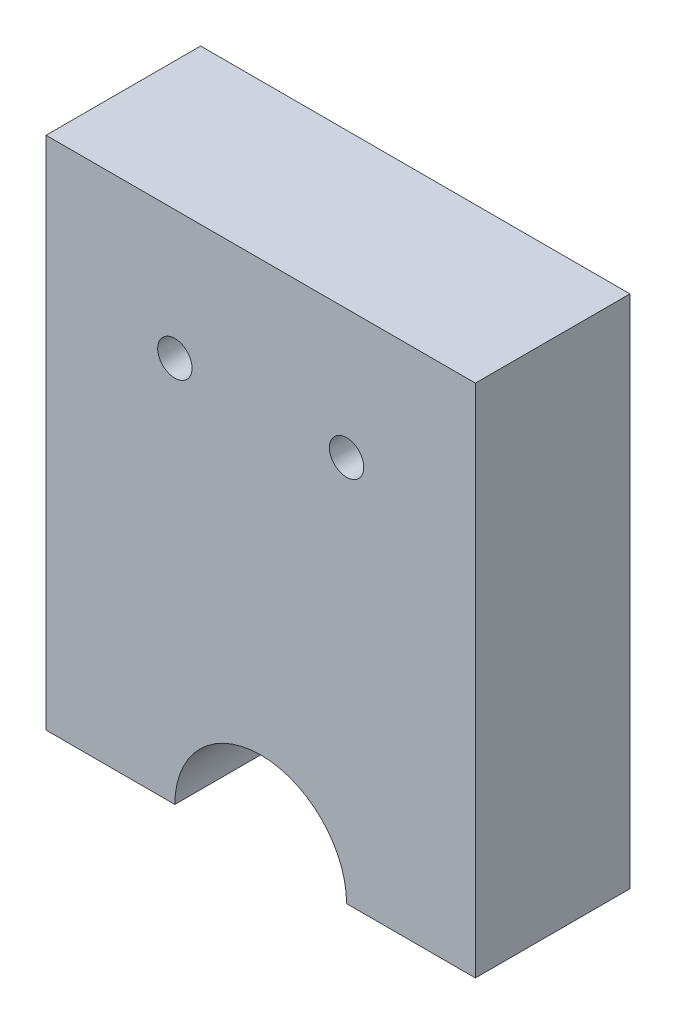
ISO-10303-21;
HEADER;
FILE_DESCRIPTION(('STEP AP214'),'2;1');
FILE_NAME('part.step','',(''),(''),'','','');
FILE_SCHEMA(('AUTOMOTIVE_DESIGN { 1 0 10303 214 1 1 1 1 }'));
ENDSEC;
DATA;
#1=APPLICATION_CONTEXT('core data for automotive mechanical design processes');
#2=APPLICATION_PROTOCOL_DEFINITION('international standard','automotive_design',2000,#1);
#3=PRODUCT_CONTEXT('',#1,'mechanical');
#4=PRODUCT('Part','Part','',(#3));
#5=PRODUCT_RELATED_PRODUCT_CATEGORY('part','',(#4));
#6=PRODUCT_DEFINITION_FORMATION('','',#4);
#7=PRODUCT_DEFINITION_CONTEXT('part definition',#1,'design');
#8=PRODUCT_DEFINITION('design','',#6,#7);
#9=PRODUCT_DEFINITION_SHAPE('','',#8);
#10=(LENGTH_UNIT() NAMED_UNIT(*) SI_UNIT(.MILLI.,.METRE.));
#11=(NAMED_UNIT(*) PLANE_ANGLE_UNIT() SI_UNIT($,.RADIAN.));
#12=(NAMED_UNIT(*) SI_UNIT($,.STERADIAN.) SOLID_ANGLE_UNIT());
#13=UNCERTAINTY_MEASURE_WITH_UNIT(LENGTH_MEASURE(1.E-05),#10,'distance_accuracy_value','');
#14=(GEOMETRIC_REPRESENTATION_CONTEXT(3) GLOBAL_UNCERTAINTY_ASSIGNED_CONTEXT((#13)) GLOBAL_UNIT_ASSIGNED_CONTEXT((#10,
#11,#12)) REPRESENTATION_CONTEXT('',''));
#15=CARTESIAN_POINT('',(0.,0.,0.));
#16=DIRECTION('',(0.,0.,1.));
#17=DIRECTION('',(1.,0.,0.));
#18=AXIS2_PLACEMENT_3D('',#15,#16,#17);
#19=CARTESIAN_POINT('',(0.,0.,9.));
#20=DIRECTION('',(0.,1.,0.));
#21=DIRECTION('',(0.,0.,1.));
#22=AXIS2_PLACEMENT_3D('',#19,#20,#21);
#23=PLANE('',#22);
#24=DIRECTION('',(1.,0.,0.));
#25=VECTOR('',#24,1.);
#26=CARTESIAN_POINT('',(0.,0.,0.));
#27=LINE('',#26,#25);
#28=CARTESIAN_POINT('',(0.,0.,0.));
#29=VERTEX_POINT('',#28);
#30=CARTESIAN_POINT('',(7.5,0.,0.));
#31=VERTEX_POINT('',#30);
#32=EDGE_CURVE('E116',#29,#31,#27,.T.);
#33=ORIENTED_EDGE('',*,*,#32,.T.);
#34=DIRECTION('',(0.,0.,1.));
#35=VECTOR('',#34,1.);
#36=CARTESIAN_POINT('',(7.5,0.,0.));
#37=LINE('',#36,#35);
#38=CARTESIAN_POINT('',(7.5,0.,9.));
#39=VERTEX_POINT('',#38);
#40=EDGE_CURVE('E51',#31,#39,#37,.T.);
#41=ORIENTED_EDGE('',*,*,#40,.T.);
#42=DIRECTION('',(1.,0.,0.));
#43=VECTOR('',#42,1.);
#44=CARTESIAN_POINT('',(0.,0.,9.));
#45=LINE('',#44,#43);
#46=CARTESIAN_POINT('',(0.,0.,9.));
#47=VERTEX_POINT('',#46);
#48=EDGE_CURVE('E87',#47,#39,#45,.T.);
#49=ORIENTED_EDGE('',*,*,#48,.F.);
#50=DIRECTION('',(0.,0.,-1.));
#51=VECTOR('',#50,1.);
#52=CARTESIAN_POINT('',(0.,0.,9.));
#53=LINE('',#52,#51);
#54=EDGE_CURVE('E11',#47,#29,#53,.T.);
#55=ORIENTED_EDGE('',*,*,#54,.T.);
#56=EDGE_LOOP('',(#33,#41,#49,#55));
#57=FACE_BOUND('',#56,.T.);
#58=ADVANCED_FACE('F36',(#57),#23,.F.);
#59=CARTESIAN_POINT('',(0.,0.,9.));
#60=DIRECTION('',(1.,0.,0.));
#61=DIRECTION('',(0.,0.,-1.));
#62=AXIS2_PLACEMENT_3D('',#59,#60,#61);
#63=PLANE('',#62);
#64=DIRECTION('',(0.,-1.,0.));
#65=VECTOR('',#64,1.);
#66=CARTESIAN_POINT('',(0.,0.,0.));
#67=LINE('',#66,#65);
#68=CARTESIAN_POINT('',(0.,30.,0.));
#69=VERTEX_POINT('',#68);
#70=EDGE_CURVE('E117',#69,#29,#67,.T.);
#71=ORIENTED_EDGE('',*,*,#70,.T.);
#72=ORIENTED_EDGE('',*,*,#54,.F.);
#73=DIRECTION('',(0.,-1.,0.));
#74=VECTOR('',#73,1.);
#75=CARTESIAN_POINT('',(0.,0.,9.));
#76=LINE('',#75,#74);
#77=CARTESIAN_POINT('',(0.,30.,9.));
#78=VERTEX_POINT('',#77);
#79=EDGE_CURVE('E125',#78,#47,#76,.T.);
#80=ORIENTED_EDGE('',*,*,#79,.F.);
#81=DIRECTION('',(0.,0.,-1.));
#82=VECTOR('',#81,1.);
#83=CARTESIAN_POINT('',(0.,30.,9.));
#84=LINE('',#83,#82);
#85=EDGE_CURVE('E126',#78,#69,#84,.T.);
#86=ORIENTED_EDGE('',*,*,#85,.T.);
#87=EDGE_LOOP('',(#71,#72,#80,#86));
#88=FACE_BOUND('',#87,.T.);
#89=ADVANCED_FACE('F38',(#88),#63,.F.);
#90=CARTESIAN_POINT('',(17.5,0.,9.));
#91=VERTEX_POINT('',#90);
#92=CARTESIAN_POINT('',(25.,0.,9.));
#93=VERTEX_POINT('',#92);
#94=EDGE_CURVE('E111',#91,#93,#45,.T.);
#95=ORIENTED_EDGE('',*,*,#94,.F.);
#96=DIRECTION('',(0.,0.,1.));
#97=VECTOR('',#96,1.);
#98=CARTESIAN_POINT('',(17.5,0.,0.));
#99=LINE('',#98,#97);
#100=CARTESIAN_POINT('',(17.5,0.,0.));
#101=VERTEX_POINT('',#100);
#102=EDGE_CURVE('E98',#101,#91,#99,.T.);
#103=ORIENTED_EDGE('',*,*,#102,.F.);
#104=CARTESIAN_POINT('',(25.,0.,0.));
#105=VERTEX_POINT('',#104);
#106=EDGE_CURVE('E109',#101,#105,#27,.T.);
#107=ORIENTED_EDGE('',*,*,#106,.T.);
#108=DIRECTION('',(0.,0.,-1.));
#109=VECTOR('',#108,1.);
#110=CARTESIAN_POINT('',(25.,0.,9.));
#111=LINE('',#110,#109);
#112=EDGE_CURVE('E44',#93,#105,#111,.T.);
#113=ORIENTED_EDGE('',*,*,#112,.F.);
#114=EDGE_LOOP('',(#95,#103,#107,#113));
#115=FACE_BOUND('',#114,.T.);
#116=ADVANCED_FACE('F107',(#115),#23,.F.);
#117=CARTESIAN_POINT('',(25.,0.,9.));
#118=DIRECTION('',(-1.,0.,0.));
#119=DIRECTION('',(0.,0.,1.));
#120=AXIS2_PLACEMENT_3D('',#117,#118,#119);
#121=PLANE('',#120);
#122=DIRECTION('',(0.,1.,0.));
#123=VECTOR('',#122,1.);
#124=CARTESIAN_POINT('',(25.,0.,0.));
#125=LINE('',#124,#123);
#126=CARTESIAN_POINT('',(25.,30.,0.));
#127=VERTEX_POINT('',#126);
#128=EDGE_CURVE('E115',#105,#127,#125,.T.);
#129=ORIENTED_EDGE('',*,*,#128,.T.);
#130=DIRECTION('',(0.,0.,-1.));
#131=VECTOR('',#130,1.);
#132=CARTESIAN_POINT('',(25.,30.,9.));
#133=LINE('',#132,#131);
#134=CARTESIAN_POINT('',(25.,30.,9.));
#135=VERTEX_POINT('',#134);
#136=EDGE_CURVE('E128',#135,#127,#133,.T.);
#137=ORIENTED_EDGE('',*,*,#136,.F.);
#138=DIRECTION('',(0.,1.,0.));
#139=VECTOR('',#138,1.);
#140=CARTESIAN_POINT('',(25.,0.,9.));
#141=LINE('',#140,#139);
#142=EDGE_CURVE('E133',#93,#135,#141,.T.);
#143=ORIENTED_EDGE('',*,*,#142,.F.);
#144=ORIENTED_EDGE('',*,*,#112,.T.);
#145=EDGE_LOOP('',(#129,#137,#143,#144));
#146=FACE_BOUND('',#145,.T.);
#147=ADVANCED_FACE('F131',(#146),#121,.F.);
#148=CARTESIAN_POINT('',(0.,30.,9.));
#149=DIRECTION('',(0.,-1.,0.));
#150=DIRECTION('',(0.,0.,-1.));
#151=AXIS2_PLACEMENT_3D('',#148,#149,#150);
#152=PLANE('',#151);
#153=DIRECTION('',(-1.,0.,0.));
#154=VECTOR('',#153,1.);
#155=CARTESIAN_POINT('',(0.,30.,0.));
#156=LINE('',#155,#154);
#157=EDGE_CURVE('E81',#127,#69,#156,.T.);
#158=ORIENTED_EDGE('',*,*,#157,.T.);
#159=ORIENTED_EDGE('',*,*,#85,.F.);
#160=DIRECTION('',(-1.,0.,0.));
#161=VECTOR('',#160,1.);
#162=CARTESIAN_POINT('',(0.,30.,9.));
#163=LINE('',#162,#161);
#164=EDGE_CURVE('E60',#135,#78,#163,.T.);
#165=ORIENTED_EDGE('',*,*,#164,.F.);
#166=ORIENTED_EDGE('',*,*,#136,.T.);
#167=EDGE_LOOP('',(#158,#159,#165,#166));
#168=FACE_BOUND('',#167,.T.);
#169=ADVANCED_FACE('F165',(#168),#152,.F.);
#170=CARTESIAN_POINT('',(0.,0.,9.));
#171=DIRECTION('',(0.,0.,-1.));
#172=DIRECTION('',(-1.,0.,0.));
#173=AXIS2_PLACEMENT_3D('',#170,#171,#172);
#174=PLANE('',#173);
#175=CARTESIAN_POINT('',(7.5,22.5,9.));
#176=DIRECTION('',(0.,0.,1.));
#177=DIRECTION('',(1.,0.,0.));
#178=AXIS2_PLACEMENT_3D('',#175,#176,#177);
#179=CIRCLE('',#178,1.);
#180=CARTESIAN_POINT('',(8.5,22.5,9.));
#181=VERTEX_POINT('',#180);
#182=EDGE_CURVE('E147',#181,#181,#179,.T.);
#183=ORIENTED_EDGE('',*,*,#182,.F.);
#184=EDGE_LOOP('',(#183));
#185=FACE_BOUND('',#184,.T.);
#186=CARTESIAN_POINT('',(17.5,22.5,9.));
#187=DIRECTION('',(0.,0.,1.));
#188=DIRECTION('',(-1.,0.,0.));
#189=AXIS2_PLACEMENT_3D('',#186,#187,#188);
#190=CIRCLE('',#189,0.999999999999998);
#191=CARTESIAN_POINT('',(16.5,22.5,9.));
#192=VERTEX_POINT('',#191);
#193=EDGE_CURVE('E141',#192,#192,#190,.T.);
#194=ORIENTED_EDGE('',*,*,#193,.F.);
#195=EDGE_LOOP('',(#194));
#196=FACE_BOUND('',#195,.T.);
#197=ORIENTED_EDGE('',*,*,#48,.T.);
#198=CARTESIAN_POINT('',(12.5,0.,9.));
#199=DIRECTION('',(0.,0.,1.));
#200=DIRECTION('',(1.,0.,0.));
#201=AXIS2_PLACEMENT_3D('',#198,#199,#200);
#202=CIRCLE('',#201,5.);
#203=EDGE_CURVE('E103',#91,#39,#202,.T.);
#204=ORIENTED_EDGE('',*,*,#203,.F.);
#205=ORIENTED_EDGE('',*,*,#94,.T.);
#206=ORIENTED_EDGE('',*,*,#142,.T.);
#207=ORIENTED_EDGE('',*,*,#164,.T.);
#208=ORIENTED_EDGE('',*,*,#79,.T.);
#209=EDGE_LOOP('',(#197,#204,#205,#206,#207,#208));
#210=FACE_BOUND('',#209,.T.);
#211=ADVANCED_FACE('F162',(#185,#196,#210),#174,.F.);
#212=CARTESIAN_POINT('',(0.,0.,0.));
#213=DIRECTION('',(0.,0.,-1.));
#214=DIRECTION('',(-1.,0.,0.));
#215=AXIS2_PLACEMENT_3D('',#212,#213,#214);
#216=PLANE('',#215);
#217=CARTESIAN_POINT('',(7.5,22.5,0.));
#218=DIRECTION('',(0.,0.,1.));
#219=DIRECTION('',(1.,0.,0.));
#220=AXIS2_PLACEMENT_3D('',#217,#218,#219);
#221=CIRCLE('',#220,1.);
#222=CARTESIAN_POINT('',(8.5,22.5,0.));
#223=VERTEX_POINT('',#222);
#224=EDGE_CURVE('E139',#223,#223,#221,.T.);
#225=ORIENTED_EDGE('',*,*,#224,.T.);
#226=EDGE_LOOP('',(#225));
#227=FACE_BOUND('',#226,.T.);
#228=CARTESIAN_POINT('',(17.5,22.5,0.));
#229=DIRECTION('',(0.,0.,1.));
#230=DIRECTION('',(-1.,0.,0.));
#231=AXIS2_PLACEMENT_3D('',#228,#229,#230);
#232=CIRCLE('',#231,0.999999999999998);
#233=CARTESIAN_POINT('',(16.5,22.5,0.));
#234=VERTEX_POINT('',#233);
#235=EDGE_CURVE('E144',#234,#234,#232,.T.);
#236=ORIENTED_EDGE('',*,*,#235,.T.);
#237=EDGE_LOOP('',(#236));
#238=FACE_BOUND('',#237,.T.);
#239=CARTESIAN_POINT('',(12.5,0.,0.));
#240=DIRECTION('',(0.,0.,1.));
#241=DIRECTION('',(1.,0.,0.));
#242=AXIS2_PLACEMENT_3D('',#239,#240,#241);
#243=CIRCLE('',#242,5.);
#244=EDGE_CURVE('E95',#101,#31,#243,.T.);
#245=ORIENTED_EDGE('',*,*,#244,.T.);
#246=ORIENTED_EDGE('',*,*,#32,.F.);
#247=ORIENTED_EDGE('',*,*,#70,.F.);
#248=ORIENTED_EDGE('',*,*,#157,.F.);
#249=ORIENTED_EDGE('',*,*,#128,.F.);
#250=ORIENTED_EDGE('',*,*,#106,.F.);
#251=EDGE_LOOP('',(#245,#246,#247,#248,#249,#250));
#252=FACE_BOUND('',#251,.T.);
#253=ADVANCED_FACE('F114',(#227,#238,#252),#216,.T.);
#254=CARTESIAN_POINT('',(12.5,0.,0.));
#255=DIRECTION('',(0.,0.,1.));
#256=DIRECTION('',(1.,0.,0.));
#257=AXIS2_PLACEMENT_3D('',#254,#255,#256);
#258=CYLINDRICAL_SURFACE('',#257,5.);
#259=ORIENTED_EDGE('',*,*,#203,.T.);
#260=ORIENTED_EDGE('',*,*,#40,.F.);
#261=ORIENTED_EDGE('',*,*,#244,.F.);
#262=ORIENTED_EDGE('',*,*,#102,.T.);
#263=EDGE_LOOP('',(#259,#260,#261,#262));
#264=FACE_BOUND('',#263,.T.);
#265=ADVANCED_FACE('F97',(#264),#258,.F.);
#266=CARTESIAN_POINT('',(17.5,22.5,0.));
#267=DIRECTION('',(0.,0.,1.));
#268=DIRECTION('',(1.,0.,0.));
#269=AXIS2_PLACEMENT_3D('',#266,#267,#268);
#270=CYLINDRICAL_SURFACE('',#269,0.999999999999998);
#271=ORIENTED_EDGE('',*,*,#235,.F.);
#272=EDGE_LOOP('',(#271));
#273=FACE_BOUND('',#272,.T.);
#274=ORIENTED_EDGE('',*,*,#193,.T.);
#275=EDGE_LOOP('',(#274));
#276=FACE_BOUND('',#275,.T.);
#277=ADVANCED_FACE('F158',(#273,#276),#270,.F.);
#278=CARTESIAN_POINT('',(7.5,22.5,0.));
#279=DIRECTION('',(0.,0.,1.));
#280=DIRECTION('',(1.,0.,0.));
#281=AXIS2_PLACEMENT_3D('',#278,#279,#280);
#282=CYLINDRICAL_SURFACE('',#281,1.);
#283=ORIENTED_EDGE('',*,*,#224,.F.);
#284=EDGE_LOOP('',(#283));
#285=FACE_BOUND('',#284,.T.);
#286=ORIENTED_EDGE('',*,*,#182,.T.);
#287=EDGE_LOOP('',(#286));
#288=FACE_BOUND('',#287,.T.);
#289=ADVANCED_FACE('F155',(#285,#288),#282,.F.);
#290=CLOSED_SHELL('',(#58,#89,#116,#147,#169,#211,#253,#265,#277,#289));
#291=MANIFOLD_SOLID_BREP('B2',#290);
#292=ADVANCED_BREP_SHAPE_REPRESENTATION('',(#18,#291),#14);
#293=SHAPE_DEFINITION_REPRESENTATION(#9,#292);
ENDSEC;
END-ISO-10303-21;
